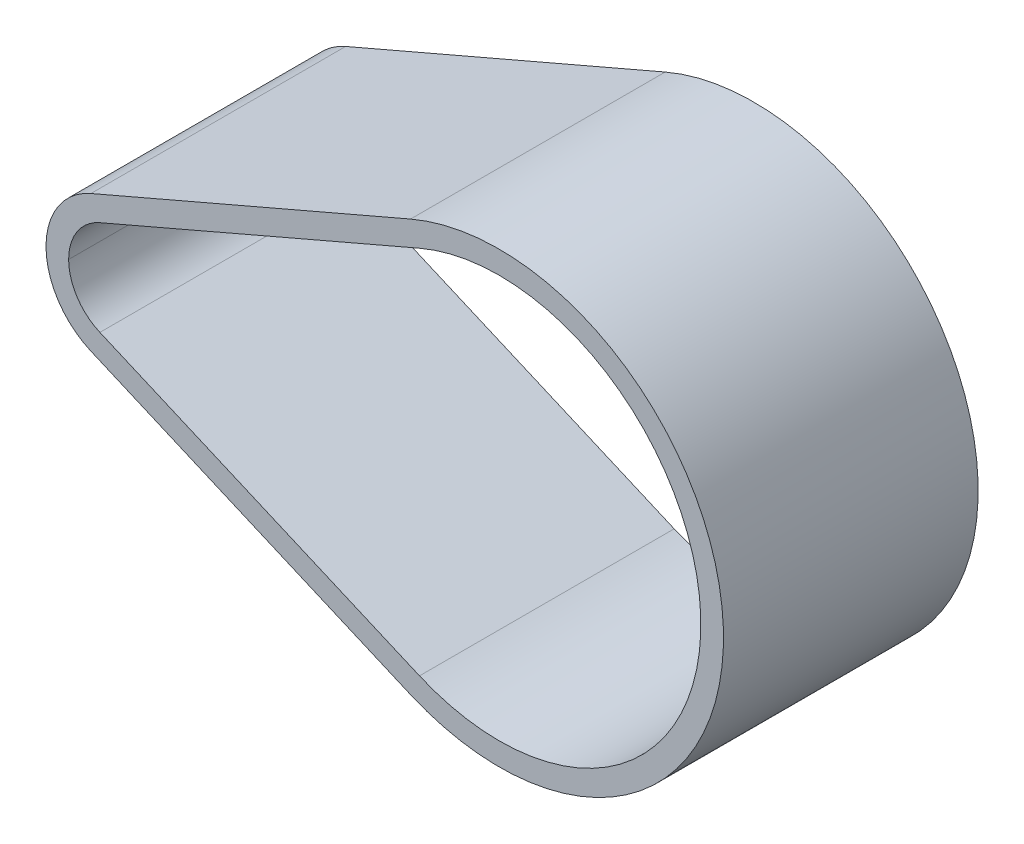
ISO-10303-21;
HEADER;
FILE_DESCRIPTION(('STEP AP214'),'2;1');
FILE_NAME('part.step','',(''),(''),'','','');
FILE_SCHEMA(('AUTOMOTIVE_DESIGN { 1 0 10303 214 1 1 1 1 }'));
ENDSEC;
DATA;
#1=APPLICATION_CONTEXT('core data for automotive mechanical design processes');
#2=APPLICATION_PROTOCOL_DEFINITION('international standard','automotive_design',2000,#1);
#3=PRODUCT_CONTEXT('',#1,'mechanical');
#4=PRODUCT('Part','Part','',(#3));
#5=PRODUCT_RELATED_PRODUCT_CATEGORY('part','',(#4));
#6=PRODUCT_DEFINITION_FORMATION('','',#4);
#7=PRODUCT_DEFINITION_CONTEXT('part definition',#1,'design');
#8=PRODUCT_DEFINITION('design','',#6,#7);
#9=PRODUCT_DEFINITION_SHAPE('','',#8);
#10=(LENGTH_UNIT() NAMED_UNIT(*) SI_UNIT(.MILLI.,.METRE.));
#11=(NAMED_UNIT(*) PLANE_ANGLE_UNIT() SI_UNIT($,.RADIAN.));
#12=(NAMED_UNIT(*) SI_UNIT($,.STERADIAN.) SOLID_ANGLE_UNIT());
#13=UNCERTAINTY_MEASURE_WITH_UNIT(LENGTH_MEASURE(1.E-05),#10,'distance_accuracy_value','');
#14=(GEOMETRIC_REPRESENTATION_CONTEXT(3) GLOBAL_UNCERTAINTY_ASSIGNED_CONTEXT((#13)) GLOBAL_UNIT_ASSIGNED_CONTEXT((#10,
#11,#12)) REPRESENTATION_CONTEXT('',''));
#15=CARTESIAN_POINT('',(0.,0.,0.));
#16=DIRECTION('',(0.,0.,1.));
#17=DIRECTION('',(1.,0.,0.));
#18=AXIS2_PLACEMENT_3D('',#15,#16,#17);
#19=CARTESIAN_POINT('',(0.,0.,45.));
#20=DIRECTION('',(0.,0.,-1.));
#21=DIRECTION('',(-1.,0.,0.));
#22=AXIS2_PLACEMENT_3D('',#19,#20,#21);
#23=CYLINDRICAL_SURFACE('',#22,9.14);
#24=CARTESIAN_POINT('',(0.,0.,45.));
#25=DIRECTION('',(0.,0.,1.));
#26=DIRECTION('',(1.,0.,0.));
#27=AXIS2_PLACEMENT_3D('',#24,#25,#26);
#28=CIRCLE('',#27,9.14);
#29=CARTESIAN_POINT('',(-3.61572666168782,8.39441008695428,45.));
#30=VERTEX_POINT('',#29);
#31=CARTESIAN_POINT('',(-9.14,0.,45.));
#32=VERTEX_POINT('',#31);
#33=EDGE_CURVE('E11',#30,#32,#28,.T.);
#34=ORIENTED_EDGE('',*,*,#33,.T.);
#35=DIRECTION('',(0.,0.,-1.));
#36=VECTOR('',#35,1.);
#37=CARTESIAN_POINT('',(-9.14,0.,45.));
#38=LINE('',#37,#36);
#39=CARTESIAN_POINT('',(-9.14,0.,0.));
#40=VERTEX_POINT('',#39);
#41=EDGE_CURVE('E27',#32,#40,#38,.T.);
#42=ORIENTED_EDGE('',*,*,#41,.T.);
#43=CARTESIAN_POINT('',(0.,0.,0.));
#44=DIRECTION('',(0.,0.,1.));
#45=DIRECTION('',(1.,0.,0.));
#46=AXIS2_PLACEMENT_3D('',#43,#44,#45);
#47=CIRCLE('',#46,9.14);
#48=CARTESIAN_POINT('',(-3.61572666168782,8.39441008695428,0.));
#49=VERTEX_POINT('',#48);
#50=EDGE_CURVE('E134',#49,#40,#47,.T.);
#51=ORIENTED_EDGE('',*,*,#50,.F.);
#52=DIRECTION('',(0.,0.,-1.));
#53=VECTOR('',#52,1.);
#54=CARTESIAN_POINT('',(-3.61572666168782,8.39441008695428,45.));
#55=LINE('',#54,#53);
#56=EDGE_CURVE('E172',#30,#49,#55,.T.);
#57=ORIENTED_EDGE('',*,*,#56,.F.);
#58=EDGE_LOOP('',(#34,#42,#51,#57));
#59=FACE_BOUND('',#58,.T.);
#60=ADVANCED_FACE('F16',(#59),#23,.F.);
#61=CARTESIAN_POINT('',(0.,0.,45.));
#62=DIRECTION('',(0.,0.,-1.));
#63=DIRECTION('',(-1.,0.,0.));
#64=AXIS2_PLACEMENT_3D('',#61,#62,#63);
#65=CYLINDRICAL_SURFACE('',#64,13.14);
#66=CARTESIAN_POINT('',(0.,0.,45.));
#67=DIRECTION('',(0.,0.,1.));
#68=DIRECTION('',(1.,0.,0.));
#69=AXIS2_PLACEMENT_3D('',#66,#67,#68);
#70=CIRCLE('',#69,13.14);
#71=CARTESIAN_POINT('',(-13.14,0.,45.));
#72=VERTEX_POINT('',#71);
#73=CARTESIAN_POINT('',(-5.19810156833457,-12.0681125320109,45.));
#74=VERTEX_POINT('',#73);
#75=EDGE_CURVE('E146',#72,#74,#70,.T.);
#76=ORIENTED_EDGE('',*,*,#75,.F.);
#77=DIRECTION('',(0.,0.,-1.));
#78=VECTOR('',#77,1.);
#79=CARTESIAN_POINT('',(-13.14,0.,45.));
#80=LINE('',#79,#78);
#81=CARTESIAN_POINT('',(-13.14,0.,0.));
#82=VERTEX_POINT('',#81);
#83=EDGE_CURVE('E143',#72,#82,#80,.T.);
#84=ORIENTED_EDGE('',*,*,#83,.T.);
#85=CARTESIAN_POINT('',(0.,0.,0.));
#86=DIRECTION('',(0.,0.,1.));
#87=DIRECTION('',(1.,0.,0.));
#88=AXIS2_PLACEMENT_3D('',#85,#86,#87);
#89=CIRCLE('',#88,13.14);
#90=CARTESIAN_POINT('',(-5.19810156833457,-12.0681125320109,0.));
#91=VERTEX_POINT('',#90);
#92=EDGE_CURVE('E145',#82,#91,#89,.T.);
#93=ORIENTED_EDGE('',*,*,#92,.T.);
#94=DIRECTION('',(0.,0.,-1.));
#95=VECTOR('',#94,1.);
#96=CARTESIAN_POINT('',(-5.19810156833457,-12.0681125320109,45.));
#97=LINE('',#96,#95);
#98=EDGE_CURVE('E169',#74,#91,#97,.T.);
#99=ORIENTED_EDGE('',*,*,#98,.F.);
#100=EDGE_LOOP('',(#76,#84,#93,#99));
#101=FACE_BOUND('',#100,.T.);
#102=ADVANCED_FACE('F268',(#101),#65,.T.);
#103=CARTESIAN_POINT('',(0.,0.,45.));
#104=DIRECTION('',(0.,0.,1.));
#105=DIRECTION('',(1.,0.,0.));
#106=AXIS2_PLACEMENT_3D('',#103,#104,#105);
#107=PLANE('',#106);
#108=CARTESIAN_POINT('',(0.,0.,45.));
#109=DIRECTION('',(0.,0.,1.));
#110=DIRECTION('',(1.,0.,0.));
#111=AXIS2_PLACEMENT_3D('',#108,#109,#110);
#112=CIRCLE('',#111,13.14);
#113=CARTESIAN_POINT('',(-5.19810156833458,12.0681125320109,45.));
#114=VERTEX_POINT('',#113);
#115=EDGE_CURVE('E129',#114,#72,#112,.T.);
#116=ORIENTED_EDGE('',*,*,#115,.T.);
#117=ORIENTED_EDGE('',*,*,#75,.T.);
#118=DIRECTION('',(0.918425611264145,-0.395593726661688,0.));
#119=VECTOR('',#118,1.);
#120=CARTESIAN_POINT('',(-5.19810156833457,-12.0681125320109,45.));
#121=LINE('',#120,#119);
#122=CARTESIAN_POINT('',(51.2745985810306,-36.3926148463417,45.));
#123=VERTEX_POINT('',#122);
#124=EDGE_CURVE('E180',#74,#123,#121,.T.);
#125=ORIENTED_EDGE('',*,*,#124,.T.);
#126=CARTESIAN_POINT('',(66.95,0.,45.));
#127=DIRECTION('',(0.,0.,1.));
#128=DIRECTION('',(1.,0.,0.));
#129=AXIS2_PLACEMENT_3D('',#126,#127,#128);
#130=CIRCLE('',#129,39.625);
#131=CARTESIAN_POINT('',(51.2745985810306,36.3926148463418,45.));
#132=VERTEX_POINT('',#131);
#133=EDGE_CURVE('E131',#123,#132,#130,.T.);
#134=ORIENTED_EDGE('',*,*,#133,.T.);
#135=DIRECTION('',(-0.918425611264145,-0.395593726661687,0.));
#136=VECTOR('',#135,1.);
#137=CARTESIAN_POINT('',(-5.19810156833458,12.0681125320109,45.));
#138=LINE('',#137,#136);
#139=EDGE_CURVE('E118',#132,#114,#138,.T.);
#140=ORIENTED_EDGE('',*,*,#139,.T.);
#141=EDGE_LOOP('',(#116,#117,#125,#134,#140));
#142=FACE_BOUND('',#141,.T.);
#143=DIRECTION('',(0.918425611264145,-0.395593726661688,0.));
#144=VECTOR('',#143,1.);
#145=CARTESIAN_POINT('',(-3.61572666168782,-8.39441008695427,45.));
#146=LINE('',#145,#144);
#147=CARTESIAN_POINT('',(-3.61572666168782,-8.39441008695427,45.));
#148=VERTEX_POINT('',#147);
#149=CARTESIAN_POINT('',(52.8569734876774,-32.7189124012852,45.));
#150=VERTEX_POINT('',#149);
#151=EDGE_CURVE('E185',#148,#150,#146,.T.);
#152=ORIENTED_EDGE('',*,*,#151,.F.);
#153=CARTESIAN_POINT('',(0.,0.,45.));
#154=DIRECTION('',(0.,0.,1.));
#155=DIRECTION('',(1.,0.,0.));
#156=AXIS2_PLACEMENT_3D('',#153,#154,#155);
#157=CIRCLE('',#156,9.14);
#158=EDGE_CURVE('E192',#32,#148,#157,.T.);
#159=ORIENTED_EDGE('',*,*,#158,.F.);
#160=ORIENTED_EDGE('',*,*,#33,.F.);
#161=DIRECTION('',(-0.918425611264145,-0.395593726661688,0.));
#162=VECTOR('',#161,1.);
#163=CARTESIAN_POINT('',(-3.61572666168782,8.39441008695428,45.));
#164=LINE('',#163,#162);
#165=CARTESIAN_POINT('',(52.8569734876774,32.7189124012852,45.));
#166=VERTEX_POINT('',#165);
#167=EDGE_CURVE('E175',#166,#30,#164,.T.);
#168=ORIENTED_EDGE('',*,*,#167,.F.);
#169=CARTESIAN_POINT('',(66.95,0.,45.));
#170=DIRECTION('',(0.,0.,1.));
#171=DIRECTION('',(1.,0.,0.));
#172=AXIS2_PLACEMENT_3D('',#169,#170,#171);
#173=CIRCLE('',#172,35.625);
#174=EDGE_CURVE('E20',#150,#166,#173,.T.);
#175=ORIENTED_EDGE('',*,*,#174,.F.);
#176=EDGE_LOOP('',(#152,#159,#160,#168,#175));
#177=FACE_BOUND('',#176,.T.);
#178=ADVANCED_FACE('F126',(#142,#177),#107,.T.);
#179=CARTESIAN_POINT('',(0.,0.,0.));
#180=DIRECTION('',(0.,0.,1.));
#181=DIRECTION('',(1.,0.,0.));
#182=AXIS2_PLACEMENT_3D('',#179,#180,#181);
#183=PLANE('',#182);
#184=CARTESIAN_POINT('',(0.,0.,0.));
#185=DIRECTION('',(0.,0.,1.));
#186=DIRECTION('',(1.,0.,0.));
#187=AXIS2_PLACEMENT_3D('',#184,#185,#186);
#188=CIRCLE('',#187,13.14);
#189=CARTESIAN_POINT('',(-5.19810156833458,12.0681125320109,0.));
#190=VERTEX_POINT('',#189);
#191=EDGE_CURVE('E153',#190,#82,#188,.T.);
#192=ORIENTED_EDGE('',*,*,#191,.F.);
#193=DIRECTION('',(-0.918425611264145,-0.395593726661687,0.));
#194=VECTOR('',#193,1.);
#195=CARTESIAN_POINT('',(-5.19810156833458,12.0681125320109,0.));
#196=LINE('',#195,#194);
#197=CARTESIAN_POINT('',(51.2745985810306,36.3926148463418,0.));
#198=VERTEX_POINT('',#197);
#199=EDGE_CURVE('E149',#198,#190,#196,.T.);
#200=ORIENTED_EDGE('',*,*,#199,.F.);
#201=CARTESIAN_POINT('',(66.95,0.,0.));
#202=DIRECTION('',(0.,0.,1.));
#203=DIRECTION('',(1.,0.,0.));
#204=AXIS2_PLACEMENT_3D('',#201,#202,#203);
#205=CIRCLE('',#204,39.625);
#206=CARTESIAN_POINT('',(51.2745985810306,-36.3926148463417,0.));
#207=VERTEX_POINT('',#206);
#208=EDGE_CURVE('E171',#207,#198,#205,.T.);
#209=ORIENTED_EDGE('',*,*,#208,.F.);
#210=DIRECTION('',(0.918425611264145,-0.395593726661688,0.));
#211=VECTOR('',#210,1.);
#212=CARTESIAN_POINT('',(-5.19810156833457,-12.0681125320109,0.));
#213=LINE('',#212,#211);
#214=EDGE_CURVE('E164',#91,#207,#213,.T.);
#215=ORIENTED_EDGE('',*,*,#214,.F.);
#216=ORIENTED_EDGE('',*,*,#92,.F.);
#217=EDGE_LOOP('',(#192,#200,#209,#215,#216));
#218=FACE_BOUND('',#217,.T.);
#219=ORIENTED_EDGE('',*,*,#50,.T.);
#220=CARTESIAN_POINT('',(0.,0.,0.));
#221=DIRECTION('',(0.,0.,1.));
#222=DIRECTION('',(1.,0.,0.));
#223=AXIS2_PLACEMENT_3D('',#220,#221,#222);
#224=CIRCLE('',#223,9.14);
#225=CARTESIAN_POINT('',(-3.61572666168782,-8.39441008695427,0.));
#226=VERTEX_POINT('',#225);
#227=EDGE_CURVE('E201',#40,#226,#224,.T.);
#228=ORIENTED_EDGE('',*,*,#227,.T.);
#229=DIRECTION('',(0.918425611264145,-0.395593726661688,0.));
#230=VECTOR('',#229,1.);
#231=CARTESIAN_POINT('',(-3.61572666168782,-8.39441008695427,0.));
#232=LINE('',#231,#230);
#233=CARTESIAN_POINT('',(52.8569734876774,-32.7189124012852,0.));
#234=VERTEX_POINT('',#233);
#235=EDGE_CURVE('E197',#226,#234,#232,.T.);
#236=ORIENTED_EDGE('',*,*,#235,.T.);
#237=CARTESIAN_POINT('',(66.95,0.,0.));
#238=DIRECTION('',(0.,0.,1.));
#239=DIRECTION('',(1.,0.,0.));
#240=AXIS2_PLACEMENT_3D('',#237,#238,#239);
#241=CIRCLE('',#240,35.625);
#242=CARTESIAN_POINT('',(52.8569734876774,32.7189124012852,0.));
#243=VERTEX_POINT('',#242);
#244=EDGE_CURVE('E161',#234,#243,#241,.T.);
#245=ORIENTED_EDGE('',*,*,#244,.T.);
#246=DIRECTION('',(-0.918425611264145,-0.395593726661688,0.));
#247=VECTOR('',#246,1.);
#248=CARTESIAN_POINT('',(-3.61572666168782,8.39441008695428,0.));
#249=LINE('',#248,#247);
#250=EDGE_CURVE('E152',#243,#49,#249,.T.);
#251=ORIENTED_EDGE('',*,*,#250,.T.);
#252=EDGE_LOOP('',(#219,#228,#236,#245,#251));
#253=FACE_BOUND('',#252,.T.);
#254=ADVANCED_FACE('F245',(#218,#253),#183,.F.);
#255=CARTESIAN_POINT('',(0.,0.,45.));
#256=DIRECTION('',(0.,0.,-1.));
#257=DIRECTION('',(-1.,0.,0.));
#258=AXIS2_PLACEMENT_3D('',#255,#256,#257);
#259=CYLINDRICAL_SURFACE('',#258,13.14);
#260=ORIENTED_EDGE('',*,*,#83,.F.);
#261=ORIENTED_EDGE('',*,*,#115,.F.);
#262=DIRECTION('',(0.,0.,-1.));
#263=VECTOR('',#262,1.);
#264=CARTESIAN_POINT('',(-5.19810156833458,12.0681125320109,45.));
#265=LINE('',#264,#263);
#266=EDGE_CURVE('E141',#114,#190,#265,.T.);
#267=ORIENTED_EDGE('',*,*,#266,.T.);
#268=ORIENTED_EDGE('',*,*,#191,.T.);
#269=EDGE_LOOP('',(#260,#261,#267,#268));
#270=FACE_BOUND('',#269,.T.);
#271=ADVANCED_FACE('F139',(#270),#259,.T.);
#272=CARTESIAN_POINT('',(-5.19810156833457,-12.0681125320109,45.));
#273=DIRECTION('',(0.395593726661688,0.918425611264145,0.));
#274=DIRECTION('',(0.,0.,-1.));
#275=AXIS2_PLACEMENT_3D('',#272,#273,#274);
#276=PLANE('',#275);
#277=ORIENTED_EDGE('',*,*,#214,.T.);
#278=DIRECTION('',(0.,0.,-1.));
#279=VECTOR('',#278,1.);
#280=CARTESIAN_POINT('',(51.2745985810306,-36.3926148463417,45.));
#281=LINE('',#280,#279);
#282=EDGE_CURVE('E177',#123,#207,#281,.T.);
#283=ORIENTED_EDGE('',*,*,#282,.F.);
#284=ORIENTED_EDGE('',*,*,#124,.F.);
#285=ORIENTED_EDGE('',*,*,#98,.T.);
#286=EDGE_LOOP('',(#277,#283,#284,#285));
#287=FACE_BOUND('',#286,.T.);
#288=ADVANCED_FACE('F293',(#287),#276,.F.);
#289=CARTESIAN_POINT('',(66.95,0.,45.));
#290=DIRECTION('',(0.,0.,-1.));
#291=DIRECTION('',(-1.,0.,0.));
#292=AXIS2_PLACEMENT_3D('',#289,#290,#291);
#293=CYLINDRICAL_SURFACE('',#292,39.625);
#294=ORIENTED_EDGE('',*,*,#208,.T.);
#295=DIRECTION('',(0.,0.,-1.));
#296=VECTOR('',#295,1.);
#297=CARTESIAN_POINT('',(51.2745985810306,36.3926148463418,45.));
#298=LINE('',#297,#296);
#299=EDGE_CURVE('E178',#132,#198,#298,.T.);
#300=ORIENTED_EDGE('',*,*,#299,.F.);
#301=ORIENTED_EDGE('',*,*,#133,.F.);
#302=ORIENTED_EDGE('',*,*,#282,.T.);
#303=EDGE_LOOP('',(#294,#300,#301,#302));
#304=FACE_BOUND('',#303,.T.);
#305=ADVANCED_FACE('F18',(#304),#293,.T.);
#306=CARTESIAN_POINT('',(-5.19810156833458,12.0681125320109,45.));
#307=DIRECTION('',(0.395593726661687,-0.918425611264145,0.));
#308=DIRECTION('',(0.,0.,-1.));
#309=AXIS2_PLACEMENT_3D('',#306,#307,#308);
#310=PLANE('',#309);
#311=ORIENTED_EDGE('',*,*,#199,.T.);
#312=ORIENTED_EDGE('',*,*,#266,.F.);
#313=ORIENTED_EDGE('',*,*,#139,.F.);
#314=ORIENTED_EDGE('',*,*,#299,.T.);
#315=EDGE_LOOP('',(#311,#312,#313,#314));
#316=FACE_BOUND('',#315,.T.);
#317=ADVANCED_FACE('F148',(#316),#310,.F.);
#318=CARTESIAN_POINT('',(0.,0.,45.));
#319=DIRECTION('',(0.,0.,-1.));
#320=DIRECTION('',(-1.,0.,0.));
#321=AXIS2_PLACEMENT_3D('',#318,#319,#320);
#322=CYLINDRICAL_SURFACE('',#321,9.14);
#323=ORIENTED_EDGE('',*,*,#41,.F.);
#324=ORIENTED_EDGE('',*,*,#158,.T.);
#325=DIRECTION('',(0.,0.,-1.));
#326=VECTOR('',#325,1.);
#327=CARTESIAN_POINT('',(-3.61572666168782,-8.39441008695427,45.));
#328=LINE('',#327,#326);
#329=EDGE_CURVE('E189',#148,#226,#328,.T.);
#330=ORIENTED_EDGE('',*,*,#329,.T.);
#331=ORIENTED_EDGE('',*,*,#227,.F.);
#332=EDGE_LOOP('',(#323,#324,#330,#331));
#333=FACE_BOUND('',#332,.T.);
#334=ADVANCED_FACE('F242',(#333),#322,.F.);
#335=CARTESIAN_POINT('',(-3.61572666168782,-8.39441008695427,45.));
#336=DIRECTION('',(0.395593726661688,0.918425611264145,0.));
#337=DIRECTION('',(0.,0.,-1.));
#338=AXIS2_PLACEMENT_3D('',#335,#336,#337);
#339=PLANE('',#338);
#340=ORIENTED_EDGE('',*,*,#235,.F.);
#341=ORIENTED_EDGE('',*,*,#329,.F.);
#342=ORIENTED_EDGE('',*,*,#151,.T.);
#343=DIRECTION('',(0.,0.,-1.));
#344=VECTOR('',#343,1.);
#345=CARTESIAN_POINT('',(52.8569734876774,-32.7189124012852,45.));
#346=LINE('',#345,#344);
#347=EDGE_CURVE('E190',#150,#234,#346,.T.);
#348=ORIENTED_EDGE('',*,*,#347,.T.);
#349=EDGE_LOOP('',(#340,#341,#342,#348));
#350=FACE_BOUND('',#349,.T.);
#351=ADVANCED_FACE('F303',(#350),#339,.T.);
#352=CARTESIAN_POINT('',(66.95,0.,45.));
#353=DIRECTION('',(0.,0.,-1.));
#354=DIRECTION('',(-1.,0.,0.));
#355=AXIS2_PLACEMENT_3D('',#352,#353,#354);
#356=CYLINDRICAL_SURFACE('',#355,35.625);
#357=ORIENTED_EDGE('',*,*,#244,.F.);
#358=ORIENTED_EDGE('',*,*,#347,.F.);
#359=ORIENTED_EDGE('',*,*,#174,.T.);
#360=DIRECTION('',(0.,0.,-1.));
#361=VECTOR('',#360,1.);
#362=CARTESIAN_POINT('',(52.8569734876774,32.7189124012852,45.));
#363=LINE('',#362,#361);
#364=EDGE_CURVE('E222',#166,#243,#363,.T.);
#365=ORIENTED_EDGE('',*,*,#364,.T.);
#366=EDGE_LOOP('',(#357,#358,#359,#365));
#367=FACE_BOUND('',#366,.T.);
#368=ADVANCED_FACE('F259',(#367),#356,.F.);
#369=CARTESIAN_POINT('',(-3.61572666168782,8.39441008695428,45.));
#370=DIRECTION('',(0.395593726661688,-0.918425611264145,0.));
#371=DIRECTION('',(0.,0.,-1.));
#372=AXIS2_PLACEMENT_3D('',#369,#370,#371);
#373=PLANE('',#372);
#374=ORIENTED_EDGE('',*,*,#250,.F.);
#375=ORIENTED_EDGE('',*,*,#364,.F.);
#376=ORIENTED_EDGE('',*,*,#167,.T.);
#377=ORIENTED_EDGE('',*,*,#56,.T.);
#378=EDGE_LOOP('',(#374,#375,#376,#377));
#379=FACE_BOUND('',#378,.T.);
#380=ADVANCED_FACE('F255',(#379),#373,.T.);
#381=CLOSED_SHELL('',(#60,#102,#178,#254,#271,#288,#305,#317,#334,#351,#368,#380));
#382=MANIFOLD_SOLID_BREP('B1',#381);
#383=ADVANCED_BREP_SHAPE_REPRESENTATION('',(#18,#382),#14);
#384=SHAPE_DEFINITION_REPRESENTATION(#9,#383);
ENDSEC;
END-ISO-10303-21;
